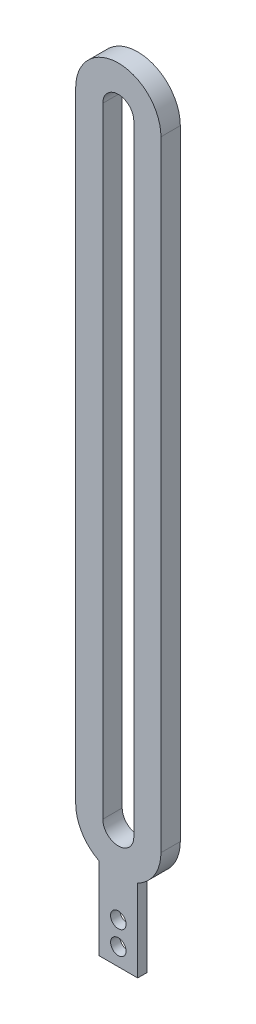
ISO-10303-21;
HEADER;
FILE_DESCRIPTION(('STEP AP214'),'2;1');
FILE_NAME('part.step','',(''),(''),'','','');
FILE_SCHEMA(('AUTOMOTIVE_DESIGN { 1 0 10303 214 1 1 1 1 }'));
ENDSEC;
DATA;
#1=APPLICATION_CONTEXT('core data for automotive mechanical design processes');
#2=APPLICATION_PROTOCOL_DEFINITION('international standard','automotive_design',2000,#1);
#3=PRODUCT_CONTEXT('',#1,'mechanical');
#4=PRODUCT('Part','Part','',(#3));
#5=PRODUCT_RELATED_PRODUCT_CATEGORY('part','',(#4));
#6=PRODUCT_DEFINITION_FORMATION('','',#4);
#7=PRODUCT_DEFINITION_CONTEXT('part definition',#1,'design');
#8=PRODUCT_DEFINITION('design','',#6,#7);
#9=PRODUCT_DEFINITION_SHAPE('','',#8);
#10=(LENGTH_UNIT() NAMED_UNIT(*) SI_UNIT(.MILLI.,.METRE.));
#11=(NAMED_UNIT(*) PLANE_ANGLE_UNIT() SI_UNIT($,.RADIAN.));
#12=(NAMED_UNIT(*) SI_UNIT($,.STERADIAN.) SOLID_ANGLE_UNIT());
#13=UNCERTAINTY_MEASURE_WITH_UNIT(LENGTH_MEASURE(1.E-05),#10,'distance_accuracy_value','');
#14=(GEOMETRIC_REPRESENTATION_CONTEXT(3) GLOBAL_UNCERTAINTY_ASSIGNED_CONTEXT((#13)) GLOBAL_UNIT_ASSIGNED_CONTEXT((#10,
#11,#12)) REPRESENTATION_CONTEXT('',''));
#15=CARTESIAN_POINT('',(0.,0.,0.));
#16=DIRECTION('',(0.,0.,1.));
#17=DIRECTION('',(1.,0.,0.));
#18=AXIS2_PLACEMENT_3D('',#15,#16,#17);
#19=CARTESIAN_POINT('',(0.,-160.,5.));
#20=DIRECTION('',(0.,0.,1.));
#21=DIRECTION('',(1.,0.,0.));
#22=AXIS2_PLACEMENT_3D('',#19,#20,#21);
#23=PLANE('',#22);
#24=CARTESIAN_POINT('',(0.,-186.5,5.));
#25=DIRECTION('',(0.,0.,-1.));
#26=DIRECTION('',(-1.,0.,0.));
#27=AXIS2_PLACEMENT_3D('',#24,#25,#26);
#28=CIRCLE('',#27,2.00000000000001);
#29=CARTESIAN_POINT('',(-2.00000000000001,-186.5,5.));
#30=VERTEX_POINT('',#29);
#31=EDGE_CURVE('E334',#30,#30,#28,.T.);
#32=ORIENTED_EDGE('',*,*,#31,.T.);
#33=EDGE_LOOP('',(#32));
#34=FACE_BOUND('',#33,.T.);
#35=CARTESIAN_POINT('',(0.,-180.5,5.));
#36=DIRECTION('',(0.,0.,-1.));
#37=DIRECTION('',(-1.,0.,0.));
#38=AXIS2_PLACEMENT_3D('',#35,#36,#37);
#39=CIRCLE('',#38,2.00000000000001);
#40=CARTESIAN_POINT('',(-2.00000000000001,-180.5,5.));
#41=VERTEX_POINT('',#40);
#42=EDGE_CURVE('E339',#41,#41,#39,.T.);
#43=ORIENTED_EDGE('',*,*,#42,.T.);
#44=EDGE_LOOP('',(#43));
#45=FACE_BOUND('',#44,.T.);
#46=CARTESIAN_POINT('',(0.,-160.,5.));
#47=DIRECTION('',(0.,0.,1.));
#48=DIRECTION('',(1.,0.,0.));
#49=AXIS2_PLACEMENT_3D('',#46,#47,#48);
#50=CIRCLE('',#49,11.);
#51=CARTESIAN_POINT('',(-11.,-160.,5.));
#52=VERTEX_POINT('',#51);
#53=CARTESIAN_POINT('',(-4.99999999999999,-169.797958971133,5.));
#54=VERTEX_POINT('',#53);
#55=EDGE_CURVE('E206',#52,#54,#50,.T.);
#56=ORIENTED_EDGE('',*,*,#55,.T.);
#57=DIRECTION('',(0.,-1.,0.));
#58=VECTOR('',#57,1.);
#59=CARTESIAN_POINT('',(-4.99999999999999,-171.,5.));
#60=LINE('',#59,#58);
#61=CARTESIAN_POINT('',(-4.99999999999999,-191.,5.));
#62=VERTEX_POINT('',#61);
#63=EDGE_CURVE('E260',#54,#62,#60,.T.);
#64=ORIENTED_EDGE('',*,*,#63,.T.);
#65=DIRECTION('',(1.,0.,0.));
#66=VECTOR('',#65,1.);
#67=CARTESIAN_POINT('',(-4.99999999999999,-191.,5.));
#68=LINE('',#67,#66);
#69=CARTESIAN_POINT('',(5.00000000000001,-191.,5.));
#70=VERTEX_POINT('',#69);
#71=EDGE_CURVE('E141',#62,#70,#68,.T.);
#72=ORIENTED_EDGE('',*,*,#71,.T.);
#73=DIRECTION('',(0.,1.,0.));
#74=VECTOR('',#73,1.);
#75=CARTESIAN_POINT('',(5.00000000000001,-171.,5.));
#76=LINE('',#75,#74);
#77=CARTESIAN_POINT('',(5.00000000000001,-169.797958971133,5.));
#78=VERTEX_POINT('',#77);
#79=EDGE_CURVE('E55',#70,#78,#76,.T.);
#80=ORIENTED_EDGE('',*,*,#79,.T.);
#81=CARTESIAN_POINT('',(11.,-160.,5.));
#82=VERTEX_POINT('',#81);
#83=EDGE_CURVE('E152',#78,#82,#50,.T.);
#84=ORIENTED_EDGE('',*,*,#83,.T.);
#85=DIRECTION('',(0.,1.,0.));
#86=VECTOR('',#85,1.);
#87=CARTESIAN_POINT('',(11.,0.,5.));
#88=LINE('',#87,#86);
#89=CARTESIAN_POINT('',(11.,0.,5.));
#90=VERTEX_POINT('',#89);
#91=EDGE_CURVE('E210',#82,#90,#88,.T.);
#92=ORIENTED_EDGE('',*,*,#91,.T.);
#93=CARTESIAN_POINT('',(0.,0.,5.));
#94=DIRECTION('',(0.,0.,1.));
#95=DIRECTION('',(-1.,0.,0.));
#96=AXIS2_PLACEMENT_3D('',#93,#94,#95);
#97=CIRCLE('',#96,11.);
#98=CARTESIAN_POINT('',(-11.,0.,5.));
#99=VERTEX_POINT('',#98);
#100=EDGE_CURVE('E213',#90,#99,#97,.T.);
#101=ORIENTED_EDGE('',*,*,#100,.T.);
#102=DIRECTION('',(0.,-1.,0.));
#103=VECTOR('',#102,1.);
#104=CARTESIAN_POINT('',(-11.,-160.,5.));
#105=LINE('',#104,#103);
#106=EDGE_CURVE('E216',#99,#52,#105,.T.);
#107=ORIENTED_EDGE('',*,*,#106,.T.);
#108=EDGE_LOOP('',(#56,#64,#72,#80,#84,#92,#101,#107));
#109=FACE_BOUND('',#108,.T.);
#110=DIRECTION('',(0.,1.,0.));
#111=VECTOR('',#110,1.);
#112=CARTESIAN_POINT('',(4.,0.,5.));
#113=LINE('',#112,#111);
#114=CARTESIAN_POINT('',(4.,-160.,5.));
#115=VERTEX_POINT('',#114);
#116=CARTESIAN_POINT('',(4.,0.,5.));
#117=VERTEX_POINT('',#116);
#118=EDGE_CURVE('E167',#115,#117,#113,.T.);
#119=ORIENTED_EDGE('',*,*,#118,.F.);
#120=CARTESIAN_POINT('',(0.,-160.,5.));
#121=DIRECTION('',(0.,0.,1.));
#122=DIRECTION('',(1.,0.,0.));
#123=AXIS2_PLACEMENT_3D('',#120,#121,#122);
#124=CIRCLE('',#123,4.);
#125=CARTESIAN_POINT('',(-4.,-160.,5.));
#126=VERTEX_POINT('',#125);
#127=EDGE_CURVE('E164',#126,#115,#124,.T.);
#128=ORIENTED_EDGE('',*,*,#127,.F.);
#129=DIRECTION('',(0.,-1.,0.));
#130=VECTOR('',#129,1.);
#131=CARTESIAN_POINT('',(-4.,-160.,5.));
#132=LINE('',#131,#130);
#133=CARTESIAN_POINT('',(-4.,0.,5.));
#134=VERTEX_POINT('',#133);
#135=EDGE_CURVE('E174',#134,#126,#132,.T.);
#136=ORIENTED_EDGE('',*,*,#135,.F.);
#137=CARTESIAN_POINT('',(0.,0.,5.));
#138=DIRECTION('',(0.,0.,1.));
#139=DIRECTION('',(-1.,0.,0.));
#140=AXIS2_PLACEMENT_3D('',#137,#138,#139);
#141=CIRCLE('',#140,4.);
#142=EDGE_CURVE('E171',#117,#134,#141,.T.);
#143=ORIENTED_EDGE('',*,*,#142,.F.);
#144=EDGE_LOOP('',(#119,#128,#136,#143));
#145=FACE_BOUND('',#144,.T.);
#146=ADVANCED_FACE('F39',(#34,#45,#109,#145),#23,.T.);
#147=CARTESIAN_POINT('',(0.,-160.,0.));
#148=DIRECTION('',(0.,0.,1.));
#149=DIRECTION('',(1.,0.,0.));
#150=AXIS2_PLACEMENT_3D('',#147,#148,#149);
#151=PLANE('',#150);
#152=CARTESIAN_POINT('',(0.,-160.,0.));
#153=DIRECTION('',(0.,0.,1.));
#154=DIRECTION('',(1.,0.,0.));
#155=AXIS2_PLACEMENT_3D('',#152,#153,#154);
#156=CIRCLE('',#155,11.);
#157=CARTESIAN_POINT('',(-11.,-160.,0.));
#158=VERTEX_POINT('',#157);
#159=CARTESIAN_POINT('',(11.,-160.,0.));
#160=VERTEX_POINT('',#159);
#161=EDGE_CURVE('E205',#158,#160,#156,.T.);
#162=ORIENTED_EDGE('',*,*,#161,.F.);
#163=DIRECTION('',(0.,-1.,0.));
#164=VECTOR('',#163,1.);
#165=CARTESIAN_POINT('',(-11.,-160.,0.));
#166=LINE('',#165,#164);
#167=CARTESIAN_POINT('',(-11.,0.,0.));
#168=VERTEX_POINT('',#167);
#169=EDGE_CURVE('E229',#168,#158,#166,.T.);
#170=ORIENTED_EDGE('',*,*,#169,.F.);
#171=CARTESIAN_POINT('',(0.,0.,0.));
#172=DIRECTION('',(0.,0.,1.));
#173=DIRECTION('',(-1.,0.,0.));
#174=AXIS2_PLACEMENT_3D('',#171,#172,#173);
#175=CIRCLE('',#174,11.);
#176=CARTESIAN_POINT('',(11.,0.,0.));
#177=VERTEX_POINT('',#176);
#178=EDGE_CURVE('E226',#177,#168,#175,.T.);
#179=ORIENTED_EDGE('',*,*,#178,.F.);
#180=DIRECTION('',(0.,1.,0.));
#181=VECTOR('',#180,1.);
#182=CARTESIAN_POINT('',(11.,0.,0.));
#183=LINE('',#182,#181);
#184=EDGE_CURVE('E223',#160,#177,#183,.T.);
#185=ORIENTED_EDGE('',*,*,#184,.F.);
#186=EDGE_LOOP('',(#162,#170,#179,#185));
#187=FACE_BOUND('',#186,.T.);
#188=CARTESIAN_POINT('',(0.,-160.,0.));
#189=DIRECTION('',(0.,0.,1.));
#190=DIRECTION('',(1.,0.,0.));
#191=AXIS2_PLACEMENT_3D('',#188,#189,#190);
#192=CIRCLE('',#191,4.);
#193=CARTESIAN_POINT('',(-4.,-160.,0.));
#194=VERTEX_POINT('',#193);
#195=CARTESIAN_POINT('',(4.,-160.,0.));
#196=VERTEX_POINT('',#195);
#197=EDGE_CURVE('E178',#194,#196,#192,.T.);
#198=ORIENTED_EDGE('',*,*,#197,.T.);
#199=DIRECTION('',(0.,1.,0.));
#200=VECTOR('',#199,1.);
#201=CARTESIAN_POINT('',(4.,0.,0.));
#202=LINE('',#201,#200);
#203=CARTESIAN_POINT('',(4.,0.,0.));
#204=VERTEX_POINT('',#203);
#205=EDGE_CURVE('E182',#196,#204,#202,.T.);
#206=ORIENTED_EDGE('',*,*,#205,.T.);
#207=CARTESIAN_POINT('',(0.,0.,0.));
#208=DIRECTION('',(0.,0.,1.));
#209=DIRECTION('',(-1.,0.,0.));
#210=AXIS2_PLACEMENT_3D('',#207,#208,#209);
#211=CIRCLE('',#210,4.);
#212=CARTESIAN_POINT('',(-4.,0.,0.));
#213=VERTEX_POINT('',#212);
#214=EDGE_CURVE('E186',#204,#213,#211,.T.);
#215=ORIENTED_EDGE('',*,*,#214,.T.);
#216=DIRECTION('',(0.,-1.,0.));
#217=VECTOR('',#216,1.);
#218=CARTESIAN_POINT('',(-4.,-160.,0.));
#219=LINE('',#218,#217);
#220=EDGE_CURVE('E168',#213,#194,#219,.T.);
#221=ORIENTED_EDGE('',*,*,#220,.T.);
#222=EDGE_LOOP('',(#198,#206,#215,#221));
#223=FACE_BOUND('',#222,.T.);
#224=ADVANCED_FACE('F251',(#187,#223),#151,.F.);
#225=CARTESIAN_POINT('',(0.,-160.,5.));
#226=DIRECTION('',(0.,0.,-1.));
#227=DIRECTION('',(-1.,0.,0.));
#228=AXIS2_PLACEMENT_3D('',#225,#226,#227);
#229=CYLINDRICAL_SURFACE('',#228,11.);
#230=CARTESIAN_POINT('',(0.,-160.,2.6));
#231=DIRECTION('',(0.,0.,-1.));
#232=DIRECTION('',(1.,0.,0.));
#233=AXIS2_PLACEMENT_3D('',#230,#231,#232);
#234=CIRCLE('',#233,11.);
#235=CARTESIAN_POINT('',(5.,-169.797958971133,2.6));
#236=VERTEX_POINT('',#235);
#237=CARTESIAN_POINT('',(-4.99999999999999,-169.797958971133,2.6));
#238=VERTEX_POINT('',#237);
#239=EDGE_CURVE('E140',#236,#238,#234,.T.);
#240=ORIENTED_EDGE('',*,*,#239,.T.);
#241=DIRECTION('',(0.,0.,1.));
#242=VECTOR('',#241,1.);
#243=CARTESIAN_POINT('',(-4.99999999999999,-169.797958971133,2.6));
#244=LINE('',#243,#242);
#245=EDGE_CURVE('E154',#238,#54,#244,.T.);
#246=ORIENTED_EDGE('',*,*,#245,.T.);
#247=ORIENTED_EDGE('',*,*,#55,.F.);
#248=DIRECTION('',(0.,0.,-1.));
#249=VECTOR('',#248,1.);
#250=CARTESIAN_POINT('',(-11.,-160.,5.));
#251=LINE('',#250,#249);
#252=EDGE_CURVE('E219',#52,#158,#251,.T.);
#253=ORIENTED_EDGE('',*,*,#252,.T.);
#254=ORIENTED_EDGE('',*,*,#161,.T.);
#255=DIRECTION('',(0.,0.,-1.));
#256=VECTOR('',#255,1.);
#257=CARTESIAN_POINT('',(11.,-160.,5.));
#258=LINE('',#257,#256);
#259=EDGE_CURVE('E11',#82,#160,#258,.T.);
#260=ORIENTED_EDGE('',*,*,#259,.F.);
#261=ORIENTED_EDGE('',*,*,#83,.F.);
#262=DIRECTION('',(0.,0.,1.));
#263=VECTOR('',#262,1.);
#264=CARTESIAN_POINT('',(5.,-169.797958971133,2.6));
#265=LINE('',#264,#263);
#266=EDGE_CURVE('E132',#236,#78,#265,.T.);
#267=ORIENTED_EDGE('',*,*,#266,.F.);
#268=EDGE_LOOP('',(#240,#246,#247,#253,#254,#260,#261,#267));
#269=FACE_BOUND('',#268,.T.);
#270=ADVANCED_FACE('F41',(#269),#229,.T.);
#271=CARTESIAN_POINT('',(11.,0.,5.));
#272=DIRECTION('',(-1.,0.,0.));
#273=DIRECTION('',(0.,-1.,0.));
#274=AXIS2_PLACEMENT_3D('',#271,#272,#273);
#275=PLANE('',#274);
#276=ORIENTED_EDGE('',*,*,#184,.T.);
#277=DIRECTION('',(0.,0.,-1.));
#278=VECTOR('',#277,1.);
#279=CARTESIAN_POINT('',(11.,0.,5.));
#280=LINE('',#279,#278);
#281=EDGE_CURVE('E48',#90,#177,#280,.T.);
#282=ORIENTED_EDGE('',*,*,#281,.F.);
#283=ORIENTED_EDGE('',*,*,#91,.F.);
#284=ORIENTED_EDGE('',*,*,#259,.T.);
#285=EDGE_LOOP('',(#276,#282,#283,#284));
#286=FACE_BOUND('',#285,.T.);
#287=ADVANCED_FACE('F262',(#286),#275,.F.);
#288=CARTESIAN_POINT('',(0.,0.,5.));
#289=DIRECTION('',(0.,0.,-1.));
#290=DIRECTION('',(-1.,0.,0.));
#291=AXIS2_PLACEMENT_3D('',#288,#289,#290);
#292=CYLINDRICAL_SURFACE('',#291,11.);
#293=ORIENTED_EDGE('',*,*,#178,.T.);
#294=DIRECTION('',(0.,0.,-1.));
#295=VECTOR('',#294,1.);
#296=CARTESIAN_POINT('',(-11.,0.,5.));
#297=LINE('',#296,#295);
#298=EDGE_CURVE('E235',#99,#168,#297,.T.);
#299=ORIENTED_EDGE('',*,*,#298,.F.);
#300=ORIENTED_EDGE('',*,*,#100,.F.);
#301=ORIENTED_EDGE('',*,*,#281,.T.);
#302=EDGE_LOOP('',(#293,#299,#300,#301));
#303=FACE_BOUND('',#302,.T.);
#304=ADVANCED_FACE('F244',(#303),#292,.T.);
#305=CARTESIAN_POINT('',(-11.,-160.,5.));
#306=DIRECTION('',(1.,0.,0.));
#307=DIRECTION('',(0.,1.,0.));
#308=AXIS2_PLACEMENT_3D('',#305,#306,#307);
#309=PLANE('',#308);
#310=ORIENTED_EDGE('',*,*,#169,.T.);
#311=ORIENTED_EDGE('',*,*,#252,.F.);
#312=ORIENTED_EDGE('',*,*,#106,.F.);
#313=ORIENTED_EDGE('',*,*,#298,.T.);
#314=EDGE_LOOP('',(#310,#311,#312,#313));
#315=FACE_BOUND('',#314,.T.);
#316=ADVANCED_FACE('F255',(#315),#309,.F.);
#317=CARTESIAN_POINT('',(0.,-160.,5.));
#318=DIRECTION('',(0.,0.,-1.));
#319=DIRECTION('',(-1.,0.,0.));
#320=AXIS2_PLACEMENT_3D('',#317,#318,#319);
#321=CYLINDRICAL_SURFACE('',#320,4.);
#322=ORIENTED_EDGE('',*,*,#197,.F.);
#323=DIRECTION('',(0.,0.,-1.));
#324=VECTOR('',#323,1.);
#325=CARTESIAN_POINT('',(-4.,-160.,5.));
#326=LINE('',#325,#324);
#327=EDGE_CURVE('E177',#126,#194,#326,.T.);
#328=ORIENTED_EDGE('',*,*,#327,.F.);
#329=ORIENTED_EDGE('',*,*,#127,.T.);
#330=DIRECTION('',(0.,0.,-1.));
#331=VECTOR('',#330,1.);
#332=CARTESIAN_POINT('',(4.,-160.,5.));
#333=LINE('',#332,#331);
#334=EDGE_CURVE('E201',#115,#196,#333,.T.);
#335=ORIENTED_EDGE('',*,*,#334,.T.);
#336=EDGE_LOOP('',(#322,#328,#329,#335));
#337=FACE_BOUND('',#336,.T.);
#338=ADVANCED_FACE('F279',(#337),#321,.F.);
#339=CARTESIAN_POINT('',(4.,0.,5.));
#340=DIRECTION('',(-1.,0.,0.));
#341=DIRECTION('',(0.,-1.,0.));
#342=AXIS2_PLACEMENT_3D('',#339,#340,#341);
#343=PLANE('',#342);
#344=ORIENTED_EDGE('',*,*,#205,.F.);
#345=ORIENTED_EDGE('',*,*,#334,.F.);
#346=ORIENTED_EDGE('',*,*,#118,.T.);
#347=DIRECTION('',(0.,0.,-1.));
#348=VECTOR('',#347,1.);
#349=CARTESIAN_POINT('',(4.,0.,5.));
#350=LINE('',#349,#348);
#351=EDGE_CURVE('E198',#117,#204,#350,.T.);
#352=ORIENTED_EDGE('',*,*,#351,.T.);
#353=EDGE_LOOP('',(#344,#345,#346,#352));
#354=FACE_BOUND('',#353,.T.);
#355=ADVANCED_FACE('F286',(#354),#343,.T.);
#356=CARTESIAN_POINT('',(0.,0.,5.));
#357=DIRECTION('',(0.,0.,-1.));
#358=DIRECTION('',(-1.,0.,0.));
#359=AXIS2_PLACEMENT_3D('',#356,#357,#358);
#360=CYLINDRICAL_SURFACE('',#359,4.);
#361=ORIENTED_EDGE('',*,*,#214,.F.);
#362=ORIENTED_EDGE('',*,*,#351,.F.);
#363=ORIENTED_EDGE('',*,*,#142,.T.);
#364=DIRECTION('',(0.,0.,-1.));
#365=VECTOR('',#364,1.);
#366=CARTESIAN_POINT('',(-4.,0.,5.));
#367=LINE('',#366,#365);
#368=EDGE_CURVE('E63',#134,#213,#367,.T.);
#369=ORIENTED_EDGE('',*,*,#368,.T.);
#370=EDGE_LOOP('',(#361,#362,#363,#369));
#371=FACE_BOUND('',#370,.T.);
#372=ADVANCED_FACE('F291',(#371),#360,.F.);
#373=CARTESIAN_POINT('',(-4.,-160.,5.));
#374=DIRECTION('',(1.,0.,0.));
#375=DIRECTION('',(0.,1.,0.));
#376=AXIS2_PLACEMENT_3D('',#373,#374,#375);
#377=PLANE('',#376);
#378=ORIENTED_EDGE('',*,*,#220,.F.);
#379=ORIENTED_EDGE('',*,*,#368,.F.);
#380=ORIENTED_EDGE('',*,*,#135,.T.);
#381=ORIENTED_EDGE('',*,*,#327,.T.);
#382=EDGE_LOOP('',(#378,#379,#380,#381));
#383=FACE_BOUND('',#382,.T.);
#384=ADVANCED_FACE('F296',(#383),#377,.T.);
#385=CARTESIAN_POINT('',(-4.99999999999999,-191.,2.6));
#386=DIRECTION('',(0.,-1.,0.));
#387=DIRECTION('',(0.,0.,-1.));
#388=AXIS2_PLACEMENT_3D('',#385,#386,#387);
#389=PLANE('',#388);
#390=ORIENTED_EDGE('',*,*,#71,.F.);
#391=DIRECTION('',(0.,0.,1.));
#392=VECTOR('',#391,1.);
#393=CARTESIAN_POINT('',(-4.99999999999999,-191.,2.6));
#394=LINE('',#393,#392);
#395=CARTESIAN_POINT('',(-4.99999999999999,-191.,2.6));
#396=VERTEX_POINT('',#395);
#397=EDGE_CURVE('E159',#396,#62,#394,.T.);
#398=ORIENTED_EDGE('',*,*,#397,.F.);
#399=DIRECTION('',(1.,0.,0.));
#400=VECTOR('',#399,1.);
#401=CARTESIAN_POINT('',(-4.99999999999999,-191.,2.6));
#402=LINE('',#401,#400);
#403=CARTESIAN_POINT('',(5.00000000000001,-191.,2.6));
#404=VERTEX_POINT('',#403);
#405=EDGE_CURVE('E155',#396,#404,#402,.T.);
#406=ORIENTED_EDGE('',*,*,#405,.T.);
#407=DIRECTION('',(0.,0.,1.));
#408=VECTOR('',#407,1.);
#409=CARTESIAN_POINT('',(5.00000000000001,-191.,2.6));
#410=LINE('',#409,#408);
#411=EDGE_CURVE('E135',#404,#70,#410,.T.);
#412=ORIENTED_EDGE('',*,*,#411,.T.);
#413=EDGE_LOOP('',(#390,#398,#406,#412));
#414=FACE_BOUND('',#413,.T.);
#415=ADVANCED_FACE('F308',(#414),#389,.T.);
#416=CARTESIAN_POINT('',(-4.99999999999999,-171.,2.6));
#417=DIRECTION('',(-1.,0.,0.));
#418=DIRECTION('',(0.,-1.,0.));
#419=AXIS2_PLACEMENT_3D('',#416,#417,#418);
#420=PLANE('',#419);
#421=ORIENTED_EDGE('',*,*,#63,.F.);
#422=ORIENTED_EDGE('',*,*,#245,.F.);
#423=DIRECTION('',(0.,-1.,0.));
#424=VECTOR('',#423,1.);
#425=CARTESIAN_POINT('',(-4.99999999999999,-171.,2.6));
#426=LINE('',#425,#424);
#427=EDGE_CURVE('E146',#238,#396,#426,.T.);
#428=ORIENTED_EDGE('',*,*,#427,.T.);
#429=ORIENTED_EDGE('',*,*,#397,.T.);
#430=EDGE_LOOP('',(#421,#422,#428,#429));
#431=FACE_BOUND('',#430,.T.);
#432=ADVANCED_FACE('F313',(#431),#420,.T.);
#433=CARTESIAN_POINT('',(5.00000000000001,-171.,2.6));
#434=DIRECTION('',(1.,0.,0.));
#435=DIRECTION('',(0.,1.,0.));
#436=AXIS2_PLACEMENT_3D('',#433,#434,#435);
#437=PLANE('',#436);
#438=ORIENTED_EDGE('',*,*,#79,.F.);
#439=ORIENTED_EDGE('',*,*,#411,.F.);
#440=DIRECTION('',(0.,1.,0.));
#441=VECTOR('',#440,1.);
#442=CARTESIAN_POINT('',(5.00000000000001,-171.,2.6));
#443=LINE('',#442,#441);
#444=EDGE_CURVE('E128',#404,#236,#443,.T.);
#445=ORIENTED_EDGE('',*,*,#444,.T.);
#446=ORIENTED_EDGE('',*,*,#266,.T.);
#447=EDGE_LOOP('',(#438,#439,#445,#446));
#448=FACE_BOUND('',#447,.T.);
#449=ADVANCED_FACE('F130',(#448),#437,.T.);
#450=CARTESIAN_POINT('',(0.,-160.,2.6));
#451=DIRECTION('',(0.,0.,1.));
#452=DIRECTION('',(1.,0.,0.));
#453=AXIS2_PLACEMENT_3D('',#450,#451,#452);
#454=PLANE('',#453);
#455=CARTESIAN_POINT('',(0.,-186.5,2.6));
#456=DIRECTION('',(0.,0.,-1.));
#457=DIRECTION('',(-1.,0.,0.));
#458=AXIS2_PLACEMENT_3D('',#455,#456,#457);
#459=CIRCLE('',#458,2.00000000000001);
#460=CARTESIAN_POINT('',(-2.00000000000001,-186.5,2.6));
#461=VERTEX_POINT('',#460);
#462=EDGE_CURVE('E337',#461,#461,#459,.T.);
#463=ORIENTED_EDGE('',*,*,#462,.F.);
#464=EDGE_LOOP('',(#463));
#465=FACE_BOUND('',#464,.T.);
#466=CARTESIAN_POINT('',(0.,-180.5,2.6));
#467=DIRECTION('',(0.,0.,-1.));
#468=DIRECTION('',(-1.,0.,0.));
#469=AXIS2_PLACEMENT_3D('',#466,#467,#468);
#470=CIRCLE('',#469,2.00000000000001);
#471=CARTESIAN_POINT('',(-2.00000000000001,-180.5,2.6));
#472=VERTEX_POINT('',#471);
#473=EDGE_CURVE('E345',#472,#472,#470,.T.);
#474=ORIENTED_EDGE('',*,*,#473,.F.);
#475=EDGE_LOOP('',(#474));
#476=FACE_BOUND('',#475,.T.);
#477=ORIENTED_EDGE('',*,*,#444,.F.);
#478=ORIENTED_EDGE('',*,*,#405,.F.);
#479=ORIENTED_EDGE('',*,*,#427,.F.);
#480=ORIENTED_EDGE('',*,*,#239,.F.);
#481=EDGE_LOOP('',(#477,#478,#479,#480));
#482=FACE_BOUND('',#481,.T.);
#483=ADVANCED_FACE('F145',(#465,#476,#482),#454,.F.);
#484=CARTESIAN_POINT('',(0.,-180.5,5.));
#485=DIRECTION('',(0.,0.,-1.));
#486=DIRECTION('',(-1.,0.,0.));
#487=AXIS2_PLACEMENT_3D('',#484,#485,#486);
#488=CYLINDRICAL_SURFACE('',#487,2.00000000000001);
#489=ORIENTED_EDGE('',*,*,#42,.F.);
#490=EDGE_LOOP('',(#489));
#491=FACE_BOUND('',#490,.T.);
#492=ORIENTED_EDGE('',*,*,#473,.T.);
#493=EDGE_LOOP('',(#492));
#494=FACE_BOUND('',#493,.T.);
#495=ADVANCED_FACE('F322',(#491,#494),#488,.F.);
#496=CARTESIAN_POINT('',(0.,-186.5,5.));
#497=DIRECTION('',(0.,0.,-1.));
#498=DIRECTION('',(-1.,0.,0.));
#499=AXIS2_PLACEMENT_3D('',#496,#497,#498);
#500=CYLINDRICAL_SURFACE('',#499,2.00000000000001);
#501=ORIENTED_EDGE('',*,*,#31,.F.);
#502=EDGE_LOOP('',(#501));
#503=FACE_BOUND('',#502,.T.);
#504=ORIENTED_EDGE('',*,*,#462,.T.);
#505=EDGE_LOOP('',(#504));
#506=FACE_BOUND('',#505,.T.);
#507=ADVANCED_FACE('F326',(#503,#506),#500,.F.);
#508=CLOSED_SHELL('',(#146,#224,#270,#287,#304,#316,#338,#355,#372,#384,#415,#432,#449,#483,
#495,#507));
#509=MANIFOLD_SOLID_BREP('B2',#508);
#510=ADVANCED_BREP_SHAPE_REPRESENTATION('',(#18,#509),#14);
#511=SHAPE_DEFINITION_REPRESENTATION(#9,#510);
ENDSEC;
END-ISO-10303-21;
